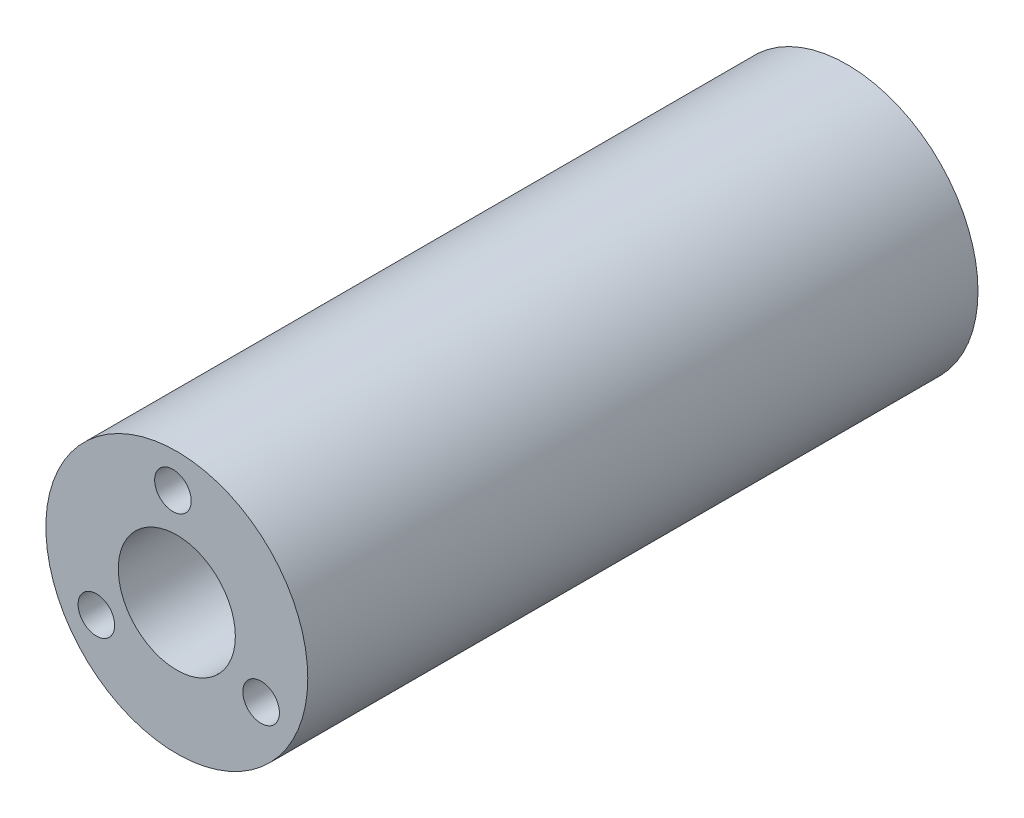
ISO-10303-21;
HEADER;
FILE_DESCRIPTION(('STEP AP214'),'2;1');
FILE_NAME('part.step','',(''),(''),'','','');
FILE_SCHEMA(('AUTOMOTIVE_DESIGN { 1 0 10303 214 1 1 1 1 }'));
ENDSEC;
DATA;
#1=APPLICATION_CONTEXT('core data for automotive mechanical design processes');
#2=APPLICATION_PROTOCOL_DEFINITION('international standard','automotive_design',2000,#1);
#3=PRODUCT_CONTEXT('',#1,'mechanical');
#4=PRODUCT('Part','Part','',(#3));
#5=PRODUCT_RELATED_PRODUCT_CATEGORY('part','',(#4));
#6=PRODUCT_DEFINITION_FORMATION('','',#4);
#7=PRODUCT_DEFINITION_CONTEXT('part definition',#1,'design');
#8=PRODUCT_DEFINITION('design','',#6,#7);
#9=PRODUCT_DEFINITION_SHAPE('','',#8);
#10=(LENGTH_UNIT() NAMED_UNIT(*) SI_UNIT(.MILLI.,.METRE.));
#11=(NAMED_UNIT(*) PLANE_ANGLE_UNIT() SI_UNIT($,.RADIAN.));
#12=(NAMED_UNIT(*) SI_UNIT($,.STERADIAN.) SOLID_ANGLE_UNIT());
#13=UNCERTAINTY_MEASURE_WITH_UNIT(LENGTH_MEASURE(1.E-05),#10,'distance_accuracy_value','');
#14=(GEOMETRIC_REPRESENTATION_CONTEXT(3) GLOBAL_UNCERTAINTY_ASSIGNED_CONTEXT((#13)) GLOBAL_UNIT_ASSIGNED_CONTEXT((#10,
#11,#12)) REPRESENTATION_CONTEXT('',''));
#15=CARTESIAN_POINT('',(0.,0.,0.));
#16=DIRECTION('',(0.,0.,1.));
#17=DIRECTION('',(1.,0.,0.));
#18=AXIS2_PLACEMENT_3D('',#15,#16,#17);
#19=CARTESIAN_POINT('',(0.,0.,45.8));
#20=DIRECTION('',(0.,0.,1.));
#21=DIRECTION('',(1.,0.,0.));
#22=AXIS2_PLACEMENT_3D('',#19,#20,#21);
#23=PLANE('',#22);
#24=CARTESIAN_POINT('',(5.76169797696947,-3.02044636602206,45.8));
#25=DIRECTION('',(0.,0.,1.));
#26=DIRECTION('',(1.,0.,0.));
#27=AXIS2_PLACEMENT_3D('',#24,#25,#26);
#28=CIRCLE('',#27,1.25);
#29=CARTESIAN_POINT('',(7.01169797696947,-3.02044636602206,45.8));
#30=VERTEX_POINT('',#29);
#31=EDGE_CURVE('E54',#30,#30,#28,.T.);
#32=ORIENTED_EDGE('',*,*,#31,.F.);
#33=EDGE_LOOP('',(#32));
#34=FACE_BOUND('',#33,.T.);
#35=CARTESIAN_POINT('',(-0.265065704741243,6.5,45.8));
#36=DIRECTION('',(0.,0.,1.));
#37=DIRECTION('',(1.,0.,0.));
#38=AXIS2_PLACEMENT_3D('',#35,#36,#37);
#39=CIRCLE('',#38,1.25);
#40=CARTESIAN_POINT('',(0.984934295258758,6.5,45.8));
#41=VERTEX_POINT('',#40);
#42=EDGE_CURVE('E43',#41,#41,#39,.T.);
#43=ORIENTED_EDGE('',*,*,#42,.F.);
#44=EDGE_LOOP('',(#43));
#45=FACE_BOUND('',#44,.T.);
#46=CARTESIAN_POINT('',(0.,0.,45.8));
#47=DIRECTION('',(0.,0.,1.));
#48=DIRECTION('',(1.,0.,0.));
#49=AXIS2_PLACEMENT_3D('',#46,#47,#48);
#50=CIRCLE('',#49,8.95);
#51=CARTESIAN_POINT('',(8.95,0.,45.8));
#52=VERTEX_POINT('',#51);
#53=EDGE_CURVE('E10',#52,#52,#50,.T.);
#54=ORIENTED_EDGE('',*,*,#53,.T.);
#55=EDGE_LOOP('',(#54));
#56=FACE_BOUND('',#55,.T.);
#57=CARTESIAN_POINT('',(-5.49663227222823,-3.47955363397794,45.8));
#58=DIRECTION('',(0.,0.,1.));
#59=DIRECTION('',(1.,0.,0.));
#60=AXIS2_PLACEMENT_3D('',#57,#58,#59);
#61=CIRCLE('',#60,1.25);
#62=CARTESIAN_POINT('',(-4.24663227222823,-3.47955363397794,45.8));
#63=VERTEX_POINT('',#62);
#64=EDGE_CURVE('E48',#63,#63,#61,.T.);
#65=ORIENTED_EDGE('',*,*,#64,.F.);
#66=EDGE_LOOP('',(#65));
#67=FACE_BOUND('',#66,.T.);
#68=CARTESIAN_POINT('',(0.,0.,45.8));
#69=DIRECTION('',(0.,0.,1.));
#70=DIRECTION('',(1.,0.,0.));
#71=AXIS2_PLACEMENT_3D('',#68,#69,#70);
#72=CIRCLE('',#71,4.);
#73=CARTESIAN_POINT('',(4.,0.,45.8));
#74=VERTEX_POINT('',#73);
#75=EDGE_CURVE('E60',#74,#74,#72,.T.);
#76=ORIENTED_EDGE('',*,*,#75,.F.);
#77=EDGE_LOOP('',(#76));
#78=FACE_BOUND('',#77,.T.);
#79=ADVANCED_FACE('F32',(#34,#45,#56,#67,#78),#23,.T.);
#80=CARTESIAN_POINT('',(0.,0.,0.));
#81=DIRECTION('',(0.,0.,1.));
#82=DIRECTION('',(1.,0.,0.));
#83=AXIS2_PLACEMENT_3D('',#80,#81,#82);
#84=PLANE('',#83);
#85=CARTESIAN_POINT('',(0.,0.,0.));
#86=DIRECTION('',(0.,0.,1.));
#87=DIRECTION('',(1.,0.,0.));
#88=AXIS2_PLACEMENT_3D('',#85,#86,#87);
#89=CIRCLE('',#88,8.95);
#90=CARTESIAN_POINT('',(8.95,0.,0.));
#91=VERTEX_POINT('',#90);
#92=EDGE_CURVE('E36',#91,#91,#89,.T.);
#93=ORIENTED_EDGE('',*,*,#92,.F.);
#94=EDGE_LOOP('',(#93));
#95=FACE_BOUND('',#94,.T.);
#96=CARTESIAN_POINT('',(-0.265065704741243,6.5,0.));
#97=DIRECTION('',(0.,0.,1.));
#98=DIRECTION('',(1.,0.,0.));
#99=AXIS2_PLACEMENT_3D('',#96,#97,#98);
#100=CIRCLE('',#99,1.25);
#101=CARTESIAN_POINT('',(0.984934295258758,6.5,0.));
#102=VERTEX_POINT('',#101);
#103=EDGE_CURVE('E45',#102,#102,#100,.T.);
#104=ORIENTED_EDGE('',*,*,#103,.T.);
#105=EDGE_LOOP('',(#104));
#106=FACE_BOUND('',#105,.T.);
#107=CARTESIAN_POINT('',(-5.49663227222823,-3.47955363397794,0.));
#108=DIRECTION('',(0.,0.,1.));
#109=DIRECTION('',(1.,0.,0.));
#110=AXIS2_PLACEMENT_3D('',#107,#108,#109);
#111=CIRCLE('',#110,1.25);
#112=CARTESIAN_POINT('',(-4.24663227222823,-3.47955363397794,0.));
#113=VERTEX_POINT('',#112);
#114=EDGE_CURVE('E51',#113,#113,#111,.T.);
#115=ORIENTED_EDGE('',*,*,#114,.T.);
#116=EDGE_LOOP('',(#115));
#117=FACE_BOUND('',#116,.T.);
#118=CARTESIAN_POINT('',(5.76169797696947,-3.02044636602206,0.));
#119=DIRECTION('',(0.,0.,1.));
#120=DIRECTION('',(1.,0.,0.));
#121=AXIS2_PLACEMENT_3D('',#118,#119,#120);
#122=CIRCLE('',#121,1.25);
#123=CARTESIAN_POINT('',(7.01169797696947,-3.02044636602206,0.));
#124=VERTEX_POINT('',#123);
#125=EDGE_CURVE('E57',#124,#124,#122,.T.);
#126=ORIENTED_EDGE('',*,*,#125,.T.);
#127=EDGE_LOOP('',(#126));
#128=FACE_BOUND('',#127,.T.);
#129=CARTESIAN_POINT('',(0.,0.,0.));
#130=DIRECTION('',(0.,0.,1.));
#131=DIRECTION('',(1.,0.,0.));
#132=AXIS2_PLACEMENT_3D('',#129,#130,#131);
#133=CIRCLE('',#132,4.);
#134=CARTESIAN_POINT('',(4.,0.,0.));
#135=VERTEX_POINT('',#134);
#136=EDGE_CURVE('E63',#135,#135,#133,.T.);
#137=ORIENTED_EDGE('',*,*,#136,.T.);
#138=EDGE_LOOP('',(#137));
#139=FACE_BOUND('',#138,.T.);
#140=ADVANCED_FACE('F73',(#95,#106,#117,#128,#139),#84,.F.);
#141=CARTESIAN_POINT('',(0.,0.,45.8));
#142=DIRECTION('',(0.,0.,-1.));
#143=DIRECTION('',(-1.,0.,0.));
#144=AXIS2_PLACEMENT_3D('',#141,#142,#143);
#145=CYLINDRICAL_SURFACE('',#144,8.95);
#146=ORIENTED_EDGE('',*,*,#53,.F.);
#147=EDGE_LOOP('',(#146));
#148=FACE_BOUND('',#147,.T.);
#149=ORIENTED_EDGE('',*,*,#92,.T.);
#150=EDGE_LOOP('',(#149));
#151=FACE_BOUND('',#150,.T.);
#152=ADVANCED_FACE('F34',(#148,#151),#145,.T.);
#153=CARTESIAN_POINT('',(-0.265065704741243,6.5,45.8));
#154=DIRECTION('',(0.,0.,-1.));
#155=DIRECTION('',(-1.,0.,0.));
#156=AXIS2_PLACEMENT_3D('',#153,#154,#155);
#157=CYLINDRICAL_SURFACE('',#156,1.25);
#158=ORIENTED_EDGE('',*,*,#42,.T.);
#159=EDGE_LOOP('',(#158));
#160=FACE_BOUND('',#159,.T.);
#161=ORIENTED_EDGE('',*,*,#103,.F.);
#162=EDGE_LOOP('',(#161));
#163=FACE_BOUND('',#162,.T.);
#164=ADVANCED_FACE('F83',(#160,#163),#157,.F.);
#165=CARTESIAN_POINT('',(-5.49663227222823,-3.47955363397794,45.8));
#166=DIRECTION('',(0.,0.,-1.));
#167=DIRECTION('',(-1.,0.,0.));
#168=AXIS2_PLACEMENT_3D('',#165,#166,#167);
#169=CYLINDRICAL_SURFACE('',#168,1.25);
#170=ORIENTED_EDGE('',*,*,#64,.T.);
#171=EDGE_LOOP('',(#170));
#172=FACE_BOUND('',#171,.T.);
#173=ORIENTED_EDGE('',*,*,#114,.F.);
#174=EDGE_LOOP('',(#173));
#175=FACE_BOUND('',#174,.T.);
#176=ADVANCED_FACE('F86',(#172,#175),#169,.F.);
#177=CARTESIAN_POINT('',(5.76169797696947,-3.02044636602206,45.8));
#178=DIRECTION('',(0.,0.,-1.));
#179=DIRECTION('',(-1.,0.,0.));
#180=AXIS2_PLACEMENT_3D('',#177,#178,#179);
#181=CYLINDRICAL_SURFACE('',#180,1.25);
#182=ORIENTED_EDGE('',*,*,#31,.T.);
#183=EDGE_LOOP('',(#182));
#184=FACE_BOUND('',#183,.T.);
#185=ORIENTED_EDGE('',*,*,#125,.F.);
#186=EDGE_LOOP('',(#185));
#187=FACE_BOUND('',#186,.T.);
#188=ADVANCED_FACE('F90',(#184,#187),#181,.F.);
#189=CARTESIAN_POINT('',(0.,0.,45.8));
#190=DIRECTION('',(0.,0.,-1.));
#191=DIRECTION('',(-1.,0.,0.));
#192=AXIS2_PLACEMENT_3D('',#189,#190,#191);
#193=CYLINDRICAL_SURFACE('',#192,4.);
#194=ORIENTED_EDGE('',*,*,#75,.T.);
#195=EDGE_LOOP('',(#194));
#196=FACE_BOUND('',#195,.T.);
#197=ORIENTED_EDGE('',*,*,#136,.F.);
#198=EDGE_LOOP('',(#197));
#199=FACE_BOUND('',#198,.T.);
#200=ADVANCED_FACE('F69',(#196,#199),#193,.F.);
#201=CLOSED_SHELL('',(#79,#140,#152,#164,#176,#188,#200));
#202=MANIFOLD_SOLID_BREP('B2',#201);
#203=ADVANCED_BREP_SHAPE_REPRESENTATION('',(#18,#202),#14);
#204=SHAPE_DEFINITION_REPRESENTATION(#9,#203);
ENDSEC;
END-ISO-10303-21;
